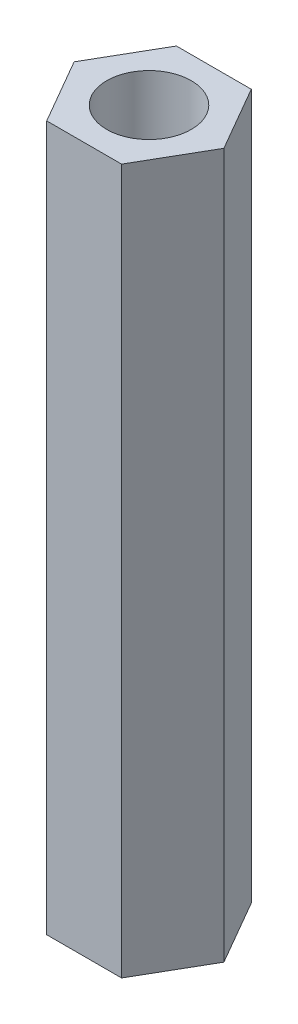
ISO-10303-21;
HEADER;
FILE_DESCRIPTION(('STEP AP214'),'2;1');
FILE_NAME('part.step','',(''),(''),'','','');
FILE_SCHEMA(('AUTOMOTIVE_DESIGN { 1 0 10303 214 1 1 1 1 }'));
ENDSEC;
DATA;
#1=APPLICATION_CONTEXT('core data for automotive mechanical design processes');
#2=APPLICATION_PROTOCOL_DEFINITION('international standard','automotive_design',2000,#1);
#3=PRODUCT_CONTEXT('',#1,'mechanical');
#4=PRODUCT('Part','Part','',(#3));
#5=PRODUCT_RELATED_PRODUCT_CATEGORY('part','',(#4));
#6=PRODUCT_DEFINITION_FORMATION('','',#4);
#7=PRODUCT_DEFINITION_CONTEXT('part definition',#1,'design');
#8=PRODUCT_DEFINITION('design','',#6,#7);
#9=PRODUCT_DEFINITION_SHAPE('','',#8);
#10=(LENGTH_UNIT() NAMED_UNIT(*) SI_UNIT(.MILLI.,.METRE.));
#11=(NAMED_UNIT(*) PLANE_ANGLE_UNIT() SI_UNIT($,.RADIAN.));
#12=(NAMED_UNIT(*) SI_UNIT($,.STERADIAN.) SOLID_ANGLE_UNIT());
#13=UNCERTAINTY_MEASURE_WITH_UNIT(LENGTH_MEASURE(1.E-05),#10,'distance_accuracy_value','');
#14=(GEOMETRIC_REPRESENTATION_CONTEXT(3) GLOBAL_UNCERTAINTY_ASSIGNED_CONTEXT((#13)) GLOBAL_UNIT_ASSIGNED_CONTEXT((#10,
#11,#12)) REPRESENTATION_CONTEXT('',''));
#15=CARTESIAN_POINT('',(0.,0.,0.));
#16=DIRECTION('',(0.,0.,1.));
#17=DIRECTION('',(1.,0.,0.));
#18=AXIS2_PLACEMENT_3D('',#15,#16,#17);
#19=CARTESIAN_POINT('',(0.,25.,0.));
#20=DIRECTION('',(0.,1.,0.));
#21=DIRECTION('',(0.,0.,1.));
#22=AXIS2_PLACEMENT_3D('',#19,#20,#21);
#23=PLANE('',#22);
#24=DIRECTION('',(0.499999999999995,0.,-0.866025403784441));
#25=VECTOR('',#24,1.);
#26=CARTESIAN_POINT('',(1.32790561913616,25.,2.29999999999997));
#27=LINE('',#26,#25);
#28=CARTESIAN_POINT('',(1.32790561913616,25.,2.29999999999997));
#29=VERTEX_POINT('',#28);
#30=CARTESIAN_POINT('',(2.65581123827227,25.,0.));
#31=VERTEX_POINT('',#30);
#32=EDGE_CURVE('E140',#29,#31,#27,.T.);
#33=ORIENTED_EDGE('',*,*,#32,.T.);
#34=DIRECTION('',(-0.500000000000001,0.,-0.866025403784438));
#35=VECTOR('',#34,1.);
#36=CARTESIAN_POINT('',(2.65581123827227,25.,0.));
#37=LINE('',#36,#35);
#38=CARTESIAN_POINT('',(1.32790561913613,25.,-2.29999999999999));
#39=VERTEX_POINT('',#38);
#40=EDGE_CURVE('E92',#31,#39,#37,.T.);
#41=ORIENTED_EDGE('',*,*,#40,.T.);
#42=DIRECTION('',(-1.,0.,0.));
#43=VECTOR('',#42,1.);
#44=CARTESIAN_POINT('',(1.32790561913613,25.,-2.29999999999999));
#45=LINE('',#44,#43);
#46=CARTESIAN_POINT('',(-1.32790561913614,25.,-2.29999999999998));
#47=VERTEX_POINT('',#46);
#48=EDGE_CURVE('E107',#39,#47,#45,.T.);
#49=ORIENTED_EDGE('',*,*,#48,.T.);
#50=DIRECTION('',(-0.499999999999995,0.,0.866025403784441));
#51=VECTOR('',#50,1.);
#52=CARTESIAN_POINT('',(-1.32790561913614,25.,-2.29999999999998));
#53=LINE('',#52,#51);
#54=CARTESIAN_POINT('',(-2.65581123827227,25.,0.));
#55=VERTEX_POINT('',#54);
#56=EDGE_CURVE('E105',#47,#55,#53,.T.);
#57=ORIENTED_EDGE('',*,*,#56,.T.);
#58=DIRECTION('',(0.500000000000007,0.,0.866025403784435));
#59=VECTOR('',#58,1.);
#60=CARTESIAN_POINT('',(-2.65581123827227,25.,0.));
#61=LINE('',#60,#59);
#62=CARTESIAN_POINT('',(-1.32790561913611,25.,2.3));
#63=VERTEX_POINT('',#62);
#64=EDGE_CURVE('E106',#55,#63,#61,.T.);
#65=ORIENTED_EDGE('',*,*,#64,.T.);
#66=DIRECTION('',(1.,0.,0.));
#67=VECTOR('',#66,1.);
#68=CARTESIAN_POINT('',(-1.32790561913611,25.,2.3));
#69=LINE('',#68,#67);
#70=EDGE_CURVE('E59',#63,#29,#69,.T.);
#71=ORIENTED_EDGE('',*,*,#70,.T.);
#72=EDGE_LOOP('',(#33,#41,#49,#57,#65,#71));
#73=FACE_BOUND('',#72,.T.);
#74=CARTESIAN_POINT('',(0.,25.,0.));
#75=DIRECTION('',(0.,1.,0.));
#76=DIRECTION('',(0.,0.,1.));
#77=AXIS2_PLACEMENT_3D('',#74,#75,#76);
#78=CIRCLE('',#77,1.5);
#79=CARTESIAN_POINT('',(0.,25.,1.5));
#80=VERTEX_POINT('',#79);
#81=EDGE_CURVE('E128',#80,#80,#78,.T.);
#82=ORIENTED_EDGE('',*,*,#81,.F.);
#83=EDGE_LOOP('',(#82));
#84=FACE_BOUND('',#83,.T.);
#85=ADVANCED_FACE('F41',(#73,#84),#23,.T.);
#86=CARTESIAN_POINT('',(0.,0.,0.));
#87=DIRECTION('',(0.,1.,0.));
#88=DIRECTION('',(0.,0.,1.));
#89=AXIS2_PLACEMENT_3D('',#86,#87,#88);
#90=PLANE('',#89);
#91=DIRECTION('',(0.499999999999995,0.,-0.866025403784441));
#92=VECTOR('',#91,1.);
#93=CARTESIAN_POINT('',(1.32790561913616,0.,2.29999999999997));
#94=LINE('',#93,#92);
#95=CARTESIAN_POINT('',(1.32790561913616,0.,2.29999999999997));
#96=VERTEX_POINT('',#95);
#97=CARTESIAN_POINT('',(2.65581123827227,0.,0.));
#98=VERTEX_POINT('',#97);
#99=EDGE_CURVE('E127',#96,#98,#94,.T.);
#100=ORIENTED_EDGE('',*,*,#99,.F.);
#101=DIRECTION('',(1.,0.,0.));
#102=VECTOR('',#101,1.);
#103=CARTESIAN_POINT('',(-1.32790561913611,0.,2.3));
#104=LINE('',#103,#102);
#105=CARTESIAN_POINT('',(-1.32790561913611,0.,2.3));
#106=VERTEX_POINT('',#105);
#107=EDGE_CURVE('E87',#106,#96,#104,.T.);
#108=ORIENTED_EDGE('',*,*,#107,.F.);
#109=DIRECTION('',(0.500000000000007,0.,0.866025403784435));
#110=VECTOR('',#109,1.);
#111=CARTESIAN_POINT('',(-2.65581123827227,0.,0.));
#112=LINE('',#111,#110);
#113=CARTESIAN_POINT('',(-2.65581123827227,0.,0.));
#114=VERTEX_POINT('',#113);
#115=EDGE_CURVE('E82',#114,#106,#112,.T.);
#116=ORIENTED_EDGE('',*,*,#115,.F.);
#117=DIRECTION('',(-0.499999999999995,0.,0.866025403784441));
#118=VECTOR('',#117,1.);
#119=CARTESIAN_POINT('',(-1.32790561913614,0.,-2.29999999999998));
#120=LINE('',#119,#118);
#121=CARTESIAN_POINT('',(-1.32790561913614,0.,-2.29999999999998));
#122=VERTEX_POINT('',#121);
#123=EDGE_CURVE('E118',#122,#114,#120,.T.);
#124=ORIENTED_EDGE('',*,*,#123,.F.);
#125=DIRECTION('',(-1.,0.,0.));
#126=VECTOR('',#125,1.);
#127=CARTESIAN_POINT('',(1.32790561913613,0.,-2.29999999999999));
#128=LINE('',#127,#126);
#129=CARTESIAN_POINT('',(1.32790561913613,0.,-2.29999999999999));
#130=VERTEX_POINT('',#129);
#131=EDGE_CURVE('E134',#130,#122,#128,.T.);
#132=ORIENTED_EDGE('',*,*,#131,.F.);
#133=DIRECTION('',(-0.500000000000001,0.,-0.866025403784438));
#134=VECTOR('',#133,1.);
#135=CARTESIAN_POINT('',(2.65581123827227,0.,0.));
#136=LINE('',#135,#134);
#137=EDGE_CURVE('E129',#98,#130,#136,.T.);
#138=ORIENTED_EDGE('',*,*,#137,.F.);
#139=EDGE_LOOP('',(#100,#108,#116,#124,#132,#138));
#140=FACE_BOUND('',#139,.T.);
#141=CARTESIAN_POINT('',(0.,0.,0.));
#142=DIRECTION('',(0.,1.,0.));
#143=DIRECTION('',(0.,0.,1.));
#144=AXIS2_PLACEMENT_3D('',#141,#142,#143);
#145=CIRCLE('',#144,1.5);
#146=CARTESIAN_POINT('',(0.,0.,1.5));
#147=VERTEX_POINT('',#146);
#148=EDGE_CURVE('E226',#147,#147,#145,.T.);
#149=ORIENTED_EDGE('',*,*,#148,.T.);
#150=EDGE_LOOP('',(#149));
#151=FACE_BOUND('',#150,.T.);
#152=ADVANCED_FACE('F148',(#140,#151),#90,.F.);
#153=CARTESIAN_POINT('',(1.32790561913616,25.,2.29999999999997));
#154=DIRECTION('',(-0.866025403784441,0.,-0.499999999999995));
#155=DIRECTION('',(-0.499999999999995,0.,0.866025403784441));
#156=AXIS2_PLACEMENT_3D('',#153,#154,#155);
#157=PLANE('',#156);
#158=ORIENTED_EDGE('',*,*,#99,.T.);
#159=DIRECTION('',(0.,-1.,0.));
#160=VECTOR('',#159,1.);
#161=CARTESIAN_POINT('',(2.65581123827227,25.,0.));
#162=LINE('',#161,#160);
#163=EDGE_CURVE('E11',#31,#98,#162,.T.);
#164=ORIENTED_EDGE('',*,*,#163,.F.);
#165=ORIENTED_EDGE('',*,*,#32,.F.);
#166=DIRECTION('',(0.,-1.,0.));
#167=VECTOR('',#166,1.);
#168=CARTESIAN_POINT('',(1.32790561913616,25.,2.29999999999997));
#169=LINE('',#168,#167);
#170=EDGE_CURVE('E125',#29,#96,#169,.T.);
#171=ORIENTED_EDGE('',*,*,#170,.T.);
#172=EDGE_LOOP('',(#158,#164,#165,#171));
#173=FACE_BOUND('',#172,.T.);
#174=ADVANCED_FACE('F43',(#173),#157,.F.);
#175=CARTESIAN_POINT('',(2.65581123827227,25.,0.));
#176=DIRECTION('',(-0.866025403784438,0.,0.500000000000001));
#177=DIRECTION('',(0.500000000000001,0.,0.866025403784438));
#178=AXIS2_PLACEMENT_3D('',#175,#176,#177);
#179=PLANE('',#178);
#180=ORIENTED_EDGE('',*,*,#137,.T.);
#181=DIRECTION('',(0.,-1.,0.));
#182=VECTOR('',#181,1.);
#183=CARTESIAN_POINT('',(1.32790561913613,25.,-2.29999999999999));
#184=LINE('',#183,#182);
#185=EDGE_CURVE('E49',#39,#130,#184,.T.);
#186=ORIENTED_EDGE('',*,*,#185,.F.);
#187=ORIENTED_EDGE('',*,*,#40,.F.);
#188=ORIENTED_EDGE('',*,*,#163,.T.);
#189=EDGE_LOOP('',(#180,#186,#187,#188));
#190=FACE_BOUND('',#189,.T.);
#191=ADVANCED_FACE('F173',(#190),#179,.F.);
#192=CARTESIAN_POINT('',(1.32790561913613,25.,-2.29999999999999));
#193=DIRECTION('',(0.,0.,1.));
#194=DIRECTION('',(1.,0.,0.));
#195=AXIS2_PLACEMENT_3D('',#192,#193,#194);
#196=PLANE('',#195);
#197=ORIENTED_EDGE('',*,*,#131,.T.);
#198=DIRECTION('',(0.,-1.,0.));
#199=VECTOR('',#198,1.);
#200=CARTESIAN_POINT('',(-1.32790561913614,25.,-2.29999999999998));
#201=LINE('',#200,#199);
#202=EDGE_CURVE('E119',#47,#122,#201,.T.);
#203=ORIENTED_EDGE('',*,*,#202,.F.);
#204=ORIENTED_EDGE('',*,*,#48,.F.);
#205=ORIENTED_EDGE('',*,*,#185,.T.);
#206=EDGE_LOOP('',(#197,#203,#204,#205));
#207=FACE_BOUND('',#206,.T.);
#208=ADVANCED_FACE('F141',(#207),#196,.F.);
#209=CARTESIAN_POINT('',(-1.32790561913614,25.,-2.29999999999998));
#210=DIRECTION('',(0.866025403784442,0.,0.499999999999995));
#211=DIRECTION('',(0.499999999999995,0.,-0.866025403784442));
#212=AXIS2_PLACEMENT_3D('',#209,#210,#211);
#213=PLANE('',#212);
#214=ORIENTED_EDGE('',*,*,#123,.T.);
#215=DIRECTION('',(0.,-1.,0.));
#216=VECTOR('',#215,1.);
#217=CARTESIAN_POINT('',(-2.65581123827227,25.,0.));
#218=LINE('',#217,#216);
#219=EDGE_CURVE('E114',#55,#114,#218,.T.);
#220=ORIENTED_EDGE('',*,*,#219,.F.);
#221=ORIENTED_EDGE('',*,*,#56,.F.);
#222=ORIENTED_EDGE('',*,*,#202,.T.);
#223=EDGE_LOOP('',(#214,#220,#221,#222));
#224=FACE_BOUND('',#223,.T.);
#225=ADVANCED_FACE('F111',(#224),#213,.F.);
#226=CARTESIAN_POINT('',(-2.65581123827227,25.,0.));
#227=DIRECTION('',(0.866025403784435,0.,-0.500000000000007));
#228=DIRECTION('',(-0.500000000000007,0.,-0.866025403784435));
#229=AXIS2_PLACEMENT_3D('',#226,#227,#228);
#230=PLANE('',#229);
#231=ORIENTED_EDGE('',*,*,#115,.T.);
#232=DIRECTION('',(0.,-1.,0.));
#233=VECTOR('',#232,1.);
#234=CARTESIAN_POINT('',(-1.32790561913611,25.,2.3));
#235=LINE('',#234,#233);
#236=EDGE_CURVE('E117',#63,#106,#235,.T.);
#237=ORIENTED_EDGE('',*,*,#236,.F.);
#238=ORIENTED_EDGE('',*,*,#64,.F.);
#239=ORIENTED_EDGE('',*,*,#219,.T.);
#240=EDGE_LOOP('',(#231,#237,#238,#239));
#241=FACE_BOUND('',#240,.T.);
#242=ADVANCED_FACE('F116',(#241),#230,.F.);
#243=CARTESIAN_POINT('',(-1.32790561913611,25.,2.3));
#244=DIRECTION('',(0.,0.,-1.));
#245=DIRECTION('',(-1.,0.,0.));
#246=AXIS2_PLACEMENT_3D('',#243,#244,#245);
#247=PLANE('',#246);
#248=ORIENTED_EDGE('',*,*,#107,.T.);
#249=ORIENTED_EDGE('',*,*,#170,.F.);
#250=ORIENTED_EDGE('',*,*,#70,.F.);
#251=ORIENTED_EDGE('',*,*,#236,.T.);
#252=EDGE_LOOP('',(#248,#249,#250,#251));
#253=FACE_BOUND('',#252,.T.);
#254=ADVANCED_FACE('F151',(#253),#247,.F.);
#255=CARTESIAN_POINT('',(0.,25.,0.));
#256=DIRECTION('',(0.,-1.,0.));
#257=DIRECTION('',(0.,0.,-1.));
#258=AXIS2_PLACEMENT_3D('',#255,#256,#257);
#259=CYLINDRICAL_SURFACE('',#258,1.5);
#260=ORIENTED_EDGE('',*,*,#81,.T.);
#261=EDGE_LOOP('',(#260));
#262=FACE_BOUND('',#261,.T.);
#263=ORIENTED_EDGE('',*,*,#148,.F.);
#264=EDGE_LOOP('',(#263));
#265=FACE_BOUND('',#264,.T.);
#266=ADVANCED_FACE('F153',(#262,#265),#259,.F.);
#267=CLOSED_SHELL('',(#85,#152,#174,#191,#208,#225,#242,#254,#266));
#268=MANIFOLD_SOLID_BREP('B2',#267);
#269=ADVANCED_BREP_SHAPE_REPRESENTATION('',(#18,#268),#14);
#270=SHAPE_DEFINITION_REPRESENTATION(#9,#269);
ENDSEC;
END-ISO-10303-21;
